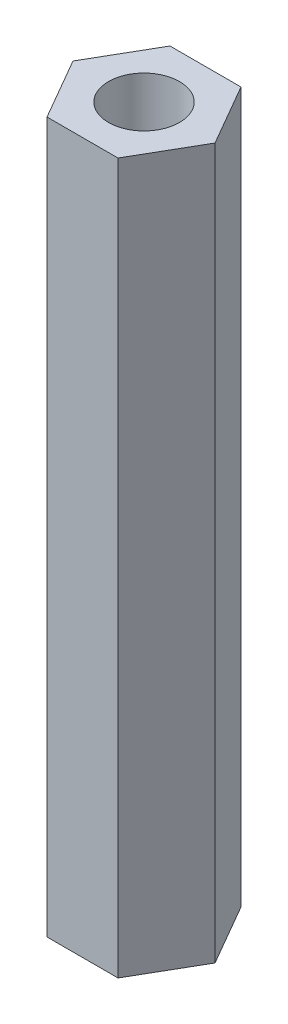
ISO-10303-21;
HEADER;
FILE_DESCRIPTION(('STEP AP214'),'2;1');
FILE_NAME('part.step','',(''),(''),'','','');
FILE_SCHEMA(('AUTOMOTIVE_DESIGN { 1 0 10303 214 1 1 1 1 }'));
ENDSEC;
DATA;
#1=APPLICATION_CONTEXT('core data for automotive mechanical design processes');
#2=APPLICATION_PROTOCOL_DEFINITION('international standard','automotive_design',2000,#1);
#3=PRODUCT_CONTEXT('',#1,'mechanical');
#4=PRODUCT('Part','Part','',(#3));
#5=PRODUCT_RELATED_PRODUCT_CATEGORY('part','',(#4));
#6=PRODUCT_DEFINITION_FORMATION('','',#4);
#7=PRODUCT_DEFINITION_CONTEXT('part definition',#1,'design');
#8=PRODUCT_DEFINITION('design','',#6,#7);
#9=PRODUCT_DEFINITION_SHAPE('','',#8);
#10=(LENGTH_UNIT() NAMED_UNIT(*) SI_UNIT(.MILLI.,.METRE.));
#11=(NAMED_UNIT(*) PLANE_ANGLE_UNIT() SI_UNIT($,.RADIAN.));
#12=(NAMED_UNIT(*) SI_UNIT($,.STERADIAN.) SOLID_ANGLE_UNIT());
#13=UNCERTAINTY_MEASURE_WITH_UNIT(LENGTH_MEASURE(1.E-05),#10,'distance_accuracy_value','');
#14=(GEOMETRIC_REPRESENTATION_CONTEXT(3) GLOBAL_UNCERTAINTY_ASSIGNED_CONTEXT((#13)) GLOBAL_UNIT_ASSIGNED_CONTEXT((#10,
#11,#12)) REPRESENTATION_CONTEXT('',''));
#15=CARTESIAN_POINT('',(0.,0.,0.));
#16=DIRECTION('',(0.,0.,1.));
#17=DIRECTION('',(1.,0.,0.));
#18=AXIS2_PLACEMENT_3D('',#15,#16,#17);
#19=CARTESIAN_POINT('',(0.,25.,0.));
#20=DIRECTION('',(0.,1.,0.));
#21=DIRECTION('',(0.,0.,1.));
#22=AXIS2_PLACEMENT_3D('',#19,#20,#21);
#23=PLANE('',#22);
#24=DIRECTION('',(-0.5,0.,-0.866025403784439));
#25=VECTOR('',#24,1.);
#26=CARTESIAN_POINT('',(2.5,25.,0.));
#27=LINE('',#26,#25);
#28=CARTESIAN_POINT('',(2.5,25.,0.));
#29=VERTEX_POINT('',#28);
#30=CARTESIAN_POINT('',(1.25,25.,-2.1650635094611));
#31=VERTEX_POINT('',#30);
#32=EDGE_CURVE('E147',#29,#31,#27,.T.);
#33=ORIENTED_EDGE('',*,*,#32,.T.);
#34=DIRECTION('',(-1.,0.,0.));
#35=VECTOR('',#34,1.);
#36=CARTESIAN_POINT('',(1.25,25.,-2.1650635094611));
#37=LINE('',#36,#35);
#38=CARTESIAN_POINT('',(-1.25,25.,-2.1650635094611));
#39=VERTEX_POINT('',#38);
#40=EDGE_CURVE('E95',#31,#39,#37,.T.);
#41=ORIENTED_EDGE('',*,*,#40,.T.);
#42=DIRECTION('',(-0.5,0.,0.866025403784439));
#43=VECTOR('',#42,1.);
#44=CARTESIAN_POINT('',(-1.25,25.,-2.1650635094611));
#45=LINE('',#44,#43);
#46=CARTESIAN_POINT('',(-2.5,25.,0.));
#47=VERTEX_POINT('',#46);
#48=EDGE_CURVE('E108',#39,#47,#45,.T.);
#49=ORIENTED_EDGE('',*,*,#48,.T.);
#50=DIRECTION('',(0.5,0.,0.866025403784439));
#51=VECTOR('',#50,1.);
#52=CARTESIAN_POINT('',(-2.5,25.,0.));
#53=LINE('',#52,#51);
#54=CARTESIAN_POINT('',(-1.25,25.,2.1650635094611));
#55=VERTEX_POINT('',#54);
#56=EDGE_CURVE('E102',#47,#55,#53,.T.);
#57=ORIENTED_EDGE('',*,*,#56,.T.);
#58=DIRECTION('',(1.,0.,0.));
#59=VECTOR('',#58,1.);
#60=CARTESIAN_POINT('',(-1.25,25.,2.1650635094611));
#61=LINE('',#60,#59);
#62=CARTESIAN_POINT('',(1.25,25.,2.1650635094611));
#63=VERTEX_POINT('',#62);
#64=EDGE_CURVE('E106',#55,#63,#61,.T.);
#65=ORIENTED_EDGE('',*,*,#64,.T.);
#66=DIRECTION('',(0.5,0.,-0.866025403784439));
#67=VECTOR('',#66,1.);
#68=CARTESIAN_POINT('',(1.25,25.,2.1650635094611));
#69=LINE('',#68,#67);
#70=EDGE_CURVE('E58',#63,#29,#69,.T.);
#71=ORIENTED_EDGE('',*,*,#70,.T.);
#72=EDGE_LOOP('',(#33,#41,#49,#57,#65,#71));
#73=FACE_BOUND('',#72,.T.);
#74=CARTESIAN_POINT('',(0.,25.,0.));
#75=DIRECTION('',(0.,1.,0.));
#76=DIRECTION('',(0.,0.,1.));
#77=AXIS2_PLACEMENT_3D('',#74,#75,#76);
#78=CIRCLE('',#77,1.25);
#79=CARTESIAN_POINT('',(0.,25.,1.25));
#80=VERTEX_POINT('',#79);
#81=EDGE_CURVE('E135',#80,#80,#78,.T.);
#82=ORIENTED_EDGE('',*,*,#81,.F.);
#83=EDGE_LOOP('',(#82));
#84=FACE_BOUND('',#83,.T.);
#85=ADVANCED_FACE('F40',(#73,#84),#23,.T.);
#86=CARTESIAN_POINT('',(0.,0.,0.));
#87=DIRECTION('',(0.,1.,0.));
#88=DIRECTION('',(0.,0.,1.));
#89=AXIS2_PLACEMENT_3D('',#86,#87,#88);
#90=PLANE('',#89);
#91=DIRECTION('',(-0.5,0.,-0.866025403784439));
#92=VECTOR('',#91,1.);
#93=CARTESIAN_POINT('',(2.5,0.,0.));
#94=LINE('',#93,#92);
#95=CARTESIAN_POINT('',(2.5,0.,0.));
#96=VERTEX_POINT('',#95);
#97=CARTESIAN_POINT('',(1.25,0.,-2.1650635094611));
#98=VERTEX_POINT('',#97);
#99=EDGE_CURVE('E130',#96,#98,#94,.T.);
#100=ORIENTED_EDGE('',*,*,#99,.F.);
#101=DIRECTION('',(0.5,0.,-0.866025403784439));
#102=VECTOR('',#101,1.);
#103=CARTESIAN_POINT('',(1.25,0.,2.1650635094611));
#104=LINE('',#103,#102);
#105=CARTESIAN_POINT('',(1.25,0.,2.1650635094611));
#106=VERTEX_POINT('',#105);
#107=EDGE_CURVE('E87',#106,#96,#104,.T.);
#108=ORIENTED_EDGE('',*,*,#107,.F.);
#109=DIRECTION('',(1.,0.,0.));
#110=VECTOR('',#109,1.);
#111=CARTESIAN_POINT('',(-1.25,0.,2.1650635094611));
#112=LINE('',#111,#110);
#113=CARTESIAN_POINT('',(-1.25,0.,2.1650635094611));
#114=VERTEX_POINT('',#113);
#115=EDGE_CURVE('E81',#114,#106,#112,.T.);
#116=ORIENTED_EDGE('',*,*,#115,.F.);
#117=DIRECTION('',(0.5,0.,0.866025403784439));
#118=VECTOR('',#117,1.);
#119=CARTESIAN_POINT('',(-2.5,0.,0.));
#120=LINE('',#119,#118);
#121=CARTESIAN_POINT('',(-2.5,0.,0.));
#122=VERTEX_POINT('',#121);
#123=EDGE_CURVE('E117',#122,#114,#120,.T.);
#124=ORIENTED_EDGE('',*,*,#123,.F.);
#125=DIRECTION('',(-0.5,0.,0.866025403784439));
#126=VECTOR('',#125,1.);
#127=CARTESIAN_POINT('',(-1.25,0.,-2.1650635094611));
#128=LINE('',#127,#126);
#129=CARTESIAN_POINT('',(-1.25,0.,-2.1650635094611));
#130=VERTEX_POINT('',#129);
#131=EDGE_CURVE('E138',#130,#122,#128,.T.);
#132=ORIENTED_EDGE('',*,*,#131,.F.);
#133=DIRECTION('',(-1.,0.,0.));
#134=VECTOR('',#133,1.);
#135=CARTESIAN_POINT('',(1.25,0.,-2.1650635094611));
#136=LINE('',#135,#134);
#137=EDGE_CURVE('E134',#98,#130,#136,.T.);
#138=ORIENTED_EDGE('',*,*,#137,.F.);
#139=EDGE_LOOP('',(#100,#108,#116,#124,#132,#138));
#140=FACE_BOUND('',#139,.T.);
#141=CARTESIAN_POINT('',(0.,0.,0.));
#142=DIRECTION('',(0.,1.,0.));
#143=DIRECTION('',(0.,0.,1.));
#144=AXIS2_PLACEMENT_3D('',#141,#142,#143);
#145=CIRCLE('',#144,1.25);
#146=CARTESIAN_POINT('',(0.,0.,1.25));
#147=VERTEX_POINT('',#146);
#148=EDGE_CURVE('E276',#147,#147,#145,.T.);
#149=ORIENTED_EDGE('',*,*,#148,.T.);
#150=EDGE_LOOP('',(#149));
#151=FACE_BOUND('',#150,.T.);
#152=ADVANCED_FACE('F160',(#140,#151),#90,.F.);
#153=CARTESIAN_POINT('',(2.5,25.,0.));
#154=DIRECTION('',(-0.866025403784439,0.,0.5));
#155=DIRECTION('',(0.5,0.,0.866025403784439));
#156=AXIS2_PLACEMENT_3D('',#153,#154,#155);
#157=PLANE('',#156);
#158=ORIENTED_EDGE('',*,*,#99,.T.);
#159=DIRECTION('',(0.,-1.,0.));
#160=VECTOR('',#159,1.);
#161=CARTESIAN_POINT('',(1.25,25.,-2.1650635094611));
#162=LINE('',#161,#160);
#163=EDGE_CURVE('E11',#31,#98,#162,.T.);
#164=ORIENTED_EDGE('',*,*,#163,.F.);
#165=ORIENTED_EDGE('',*,*,#32,.F.);
#166=DIRECTION('',(0.,-1.,0.));
#167=VECTOR('',#166,1.);
#168=CARTESIAN_POINT('',(2.5,25.,0.));
#169=LINE('',#168,#167);
#170=EDGE_CURVE('E126',#29,#96,#169,.T.);
#171=ORIENTED_EDGE('',*,*,#170,.T.);
#172=EDGE_LOOP('',(#158,#164,#165,#171));
#173=FACE_BOUND('',#172,.T.);
#174=ADVANCED_FACE('F42',(#173),#157,.F.);
#175=CARTESIAN_POINT('',(1.25,25.,-2.1650635094611));
#176=DIRECTION('',(0.,0.,1.));
#177=DIRECTION('',(1.,0.,0.));
#178=AXIS2_PLACEMENT_3D('',#175,#176,#177);
#179=PLANE('',#178);
#180=ORIENTED_EDGE('',*,*,#137,.T.);
#181=DIRECTION('',(0.,-1.,0.));
#182=VECTOR('',#181,1.);
#183=CARTESIAN_POINT('',(-1.25,25.,-2.1650635094611));
#184=LINE('',#183,#182);
#185=EDGE_CURVE('E50',#39,#130,#184,.T.);
#186=ORIENTED_EDGE('',*,*,#185,.F.);
#187=ORIENTED_EDGE('',*,*,#40,.F.);
#188=ORIENTED_EDGE('',*,*,#163,.T.);
#189=EDGE_LOOP('',(#180,#186,#187,#188));
#190=FACE_BOUND('',#189,.T.);
#191=ADVANCED_FACE('F185',(#190),#179,.F.);
#192=CARTESIAN_POINT('',(-1.25,25.,-2.1650635094611));
#193=DIRECTION('',(0.866025403784439,0.,0.5));
#194=DIRECTION('',(0.5,0.,-0.866025403784439));
#195=AXIS2_PLACEMENT_3D('',#192,#193,#194);
#196=PLANE('',#195);
#197=ORIENTED_EDGE('',*,*,#131,.T.);
#198=DIRECTION('',(0.,-1.,0.));
#199=VECTOR('',#198,1.);
#200=CARTESIAN_POINT('',(-2.5,25.,0.));
#201=LINE('',#200,#199);
#202=EDGE_CURVE('E119',#47,#122,#201,.T.);
#203=ORIENTED_EDGE('',*,*,#202,.F.);
#204=ORIENTED_EDGE('',*,*,#48,.F.);
#205=ORIENTED_EDGE('',*,*,#185,.T.);
#206=EDGE_LOOP('',(#197,#203,#204,#205));
#207=FACE_BOUND('',#206,.T.);
#208=ADVANCED_FACE('F157',(#207),#196,.F.);
#209=CARTESIAN_POINT('',(-2.5,25.,0.));
#210=DIRECTION('',(0.866025403784439,0.,-0.5));
#211=DIRECTION('',(-0.5,0.,-0.866025403784439));
#212=AXIS2_PLACEMENT_3D('',#209,#210,#211);
#213=PLANE('',#212);
#214=ORIENTED_EDGE('',*,*,#123,.T.);
#215=DIRECTION('',(0.,-1.,0.));
#216=VECTOR('',#215,1.);
#217=CARTESIAN_POINT('',(-1.25,25.,2.1650635094611));
#218=LINE('',#217,#216);
#219=EDGE_CURVE('E114',#55,#114,#218,.T.);
#220=ORIENTED_EDGE('',*,*,#219,.F.);
#221=ORIENTED_EDGE('',*,*,#56,.F.);
#222=ORIENTED_EDGE('',*,*,#202,.T.);
#223=EDGE_LOOP('',(#214,#220,#221,#222));
#224=FACE_BOUND('',#223,.T.);
#225=ADVANCED_FACE('F115',(#224),#213,.F.);
#226=CARTESIAN_POINT('',(-1.25,25.,2.1650635094611));
#227=DIRECTION('',(0.,0.,-1.));
#228=DIRECTION('',(-1.,0.,0.));
#229=AXIS2_PLACEMENT_3D('',#226,#227,#228);
#230=PLANE('',#229);
#231=ORIENTED_EDGE('',*,*,#115,.T.);
#232=DIRECTION('',(0.,-1.,0.));
#233=VECTOR('',#232,1.);
#234=CARTESIAN_POINT('',(1.25,25.,2.1650635094611));
#235=LINE('',#234,#233);
#236=EDGE_CURVE('E120',#63,#106,#235,.T.);
#237=ORIENTED_EDGE('',*,*,#236,.F.);
#238=ORIENTED_EDGE('',*,*,#64,.F.);
#239=ORIENTED_EDGE('',*,*,#219,.T.);
#240=EDGE_LOOP('',(#231,#237,#238,#239));
#241=FACE_BOUND('',#240,.T.);
#242=ADVANCED_FACE('F122',(#241),#230,.F.);
#243=CARTESIAN_POINT('',(1.25,25.,2.1650635094611));
#244=DIRECTION('',(-0.866025403784439,0.,-0.5));
#245=DIRECTION('',(-0.5,0.,0.866025403784439));
#246=AXIS2_PLACEMENT_3D('',#243,#244,#245);
#247=PLANE('',#246);
#248=ORIENTED_EDGE('',*,*,#107,.T.);
#249=ORIENTED_EDGE('',*,*,#170,.F.);
#250=ORIENTED_EDGE('',*,*,#70,.F.);
#251=ORIENTED_EDGE('',*,*,#236,.T.);
#252=EDGE_LOOP('',(#248,#249,#250,#251));
#253=FACE_BOUND('',#252,.T.);
#254=ADVANCED_FACE('F165',(#253),#247,.F.);
#255=CARTESIAN_POINT('',(0.,25.,0.));
#256=DIRECTION('',(0.,-1.,0.));
#257=DIRECTION('',(0.,0.,-1.));
#258=AXIS2_PLACEMENT_3D('',#255,#256,#257);
#259=CYLINDRICAL_SURFACE('',#258,1.25);
#260=ORIENTED_EDGE('',*,*,#81,.T.);
#261=EDGE_LOOP('',(#260));
#262=FACE_BOUND('',#261,.T.);
#263=ORIENTED_EDGE('',*,*,#148,.F.);
#264=EDGE_LOOP('',(#263));
#265=FACE_BOUND('',#264,.T.);
#266=ADVANCED_FACE('F167',(#262,#265),#259,.F.);
#267=CLOSED_SHELL('',(#85,#152,#174,#191,#208,#225,#242,#254,#266));
#268=MANIFOLD_SOLID_BREP('B2',#267);
#269=ADVANCED_BREP_SHAPE_REPRESENTATION('',(#18,#268),#14);
#270=SHAPE_DEFINITION_REPRESENTATION(#9,#269);
ENDSEC;
END-ISO-10303-21;
